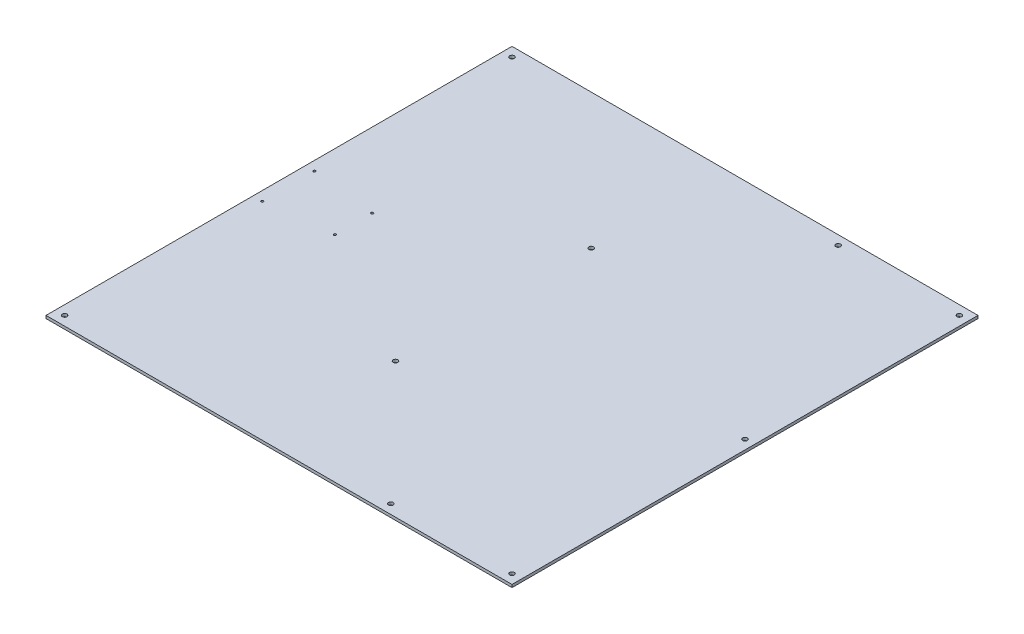
ISO-10303-21;
HEADER;
FILE_DESCRIPTION(('STEP AP214'),'2;1');
FILE_NAME('part.step','',(''),(''),'','','');
FILE_SCHEMA(('AUTOMOTIVE_DESIGN { 1 0 10303 214 1 1 1 1 }'));
ENDSEC;
DATA;
#1=APPLICATION_CONTEXT('core data for automotive mechanical design processes');
#2=APPLICATION_PROTOCOL_DEFINITION('international standard','automotive_design',2000,#1);
#3=PRODUCT_CONTEXT('',#1,'mechanical');
#4=PRODUCT('Part','Part','',(#3));
#5=PRODUCT_RELATED_PRODUCT_CATEGORY('part','',(#4));
#6=PRODUCT_DEFINITION_FORMATION('','',#4);
#7=PRODUCT_DEFINITION_CONTEXT('part definition',#1,'design');
#8=PRODUCT_DEFINITION('design','',#6,#7);
#9=PRODUCT_DEFINITION_SHAPE('','',#8);
#10=(LENGTH_UNIT() NAMED_UNIT(*) SI_UNIT(.MILLI.,.METRE.));
#11=(NAMED_UNIT(*) PLANE_ANGLE_UNIT() SI_UNIT($,.RADIAN.));
#12=(NAMED_UNIT(*) SI_UNIT($,.STERADIAN.) SOLID_ANGLE_UNIT());
#13=UNCERTAINTY_MEASURE_WITH_UNIT(LENGTH_MEASURE(1.E-05),#10,'distance_accuracy_value','');
#14=(GEOMETRIC_REPRESENTATION_CONTEXT(3) GLOBAL_UNCERTAINTY_ASSIGNED_CONTEXT((#13)) GLOBAL_UNIT_ASSIGNED_CONTEXT((#10,
#11,#12)) REPRESENTATION_CONTEXT('',''));
#15=CARTESIAN_POINT('',(0.,0.,0.));
#16=DIRECTION('',(0.,0.,1.));
#17=DIRECTION('',(1.,0.,0.));
#18=AXIS2_PLACEMENT_3D('',#15,#16,#17);
#19=CARTESIAN_POINT('',(250.,3.,-250.));
#20=DIRECTION('',(-1.,0.,0.));
#21=DIRECTION('',(0.,0.,1.));
#22=AXIS2_PLACEMENT_3D('',#19,#20,#21);
#23=PLANE('',#22);
#24=DIRECTION('',(0.,0.,-1.));
#25=VECTOR('',#24,1.);
#26=CARTESIAN_POINT('',(250.,0.,-250.));
#27=LINE('',#26,#25);
#28=CARTESIAN_POINT('',(250.,0.,250.));
#29=VERTEX_POINT('',#28);
#30=CARTESIAN_POINT('',(250.,0.,-250.));
#31=VERTEX_POINT('',#30);
#32=EDGE_CURVE('E96',#29,#31,#27,.T.);
#33=ORIENTED_EDGE('',*,*,#32,.T.);
#34=DIRECTION('',(0.,-1.,0.));
#35=VECTOR('',#34,1.);
#36=CARTESIAN_POINT('',(250.,3.,-250.));
#37=LINE('',#36,#35);
#38=CARTESIAN_POINT('',(250.,3.,-250.));
#39=VERTEX_POINT('',#38);
#40=EDGE_CURVE('E11',#39,#31,#37,.T.);
#41=ORIENTED_EDGE('',*,*,#40,.F.);
#42=DIRECTION('',(0.,0.,-1.));
#43=VECTOR('',#42,1.);
#44=CARTESIAN_POINT('',(250.,3.,-250.));
#45=LINE('',#44,#43);
#46=CARTESIAN_POINT('',(250.,3.,250.));
#47=VERTEX_POINT('',#46);
#48=EDGE_CURVE('E84',#47,#39,#45,.T.);
#49=ORIENTED_EDGE('',*,*,#48,.F.);
#50=DIRECTION('',(0.,-1.,0.));
#51=VECTOR('',#50,1.);
#52=CARTESIAN_POINT('',(250.,3.,250.));
#53=LINE('',#52,#51);
#54=EDGE_CURVE('E92',#47,#29,#53,.T.);
#55=ORIENTED_EDGE('',*,*,#54,.T.);
#56=EDGE_LOOP('',(#33,#41,#49,#55));
#57=FACE_BOUND('',#56,.T.);
#58=ADVANCED_FACE('F33',(#57),#23,.F.);
#59=CARTESIAN_POINT('',(-250.,3.,-250.));
#60=DIRECTION('',(0.,0.,1.));
#61=DIRECTION('',(1.,0.,0.));
#62=AXIS2_PLACEMENT_3D('',#59,#60,#61);
#63=PLANE('',#62);
#64=DIRECTION('',(-1.,0.,0.));
#65=VECTOR('',#64,1.);
#66=CARTESIAN_POINT('',(-250.,0.,-250.));
#67=LINE('',#66,#65);
#68=CARTESIAN_POINT('',(-250.,0.,-250.));
#69=VERTEX_POINT('',#68);
#70=EDGE_CURVE('E88',#31,#69,#67,.T.);
#71=ORIENTED_EDGE('',*,*,#70,.T.);
#72=DIRECTION('',(0.,-1.,0.));
#73=VECTOR('',#72,1.);
#74=CARTESIAN_POINT('',(-250.,3.,-250.));
#75=LINE('',#74,#73);
#76=CARTESIAN_POINT('',(-250.,3.,-250.));
#77=VERTEX_POINT('',#76);
#78=EDGE_CURVE('E41',#77,#69,#75,.T.);
#79=ORIENTED_EDGE('',*,*,#78,.F.);
#80=DIRECTION('',(-1.,0.,0.));
#81=VECTOR('',#80,1.);
#82=CARTESIAN_POINT('',(-250.,3.,-250.));
#83=LINE('',#82,#81);
#84=EDGE_CURVE('E79',#39,#77,#83,.T.);
#85=ORIENTED_EDGE('',*,*,#84,.F.);
#86=ORIENTED_EDGE('',*,*,#40,.T.);
#87=EDGE_LOOP('',(#71,#79,#85,#86));
#88=FACE_BOUND('',#87,.T.);
#89=ADVANCED_FACE('F87',(#88),#63,.F.);
#90=CARTESIAN_POINT('',(-250.,3.,-250.));
#91=DIRECTION('',(1.,0.,0.));
#92=DIRECTION('',(0.,0.,-1.));
#93=AXIS2_PLACEMENT_3D('',#90,#91,#92);
#94=PLANE('',#93);
#95=DIRECTION('',(0.,0.,1.));
#96=VECTOR('',#95,1.);
#97=CARTESIAN_POINT('',(-250.,0.,-250.));
#98=LINE('',#97,#96);
#99=CARTESIAN_POINT('',(-250.,0.,250.));
#100=VERTEX_POINT('',#99);
#101=EDGE_CURVE('E66',#69,#100,#98,.T.);
#102=ORIENTED_EDGE('',*,*,#101,.T.);
#103=DIRECTION('',(0.,-1.,0.));
#104=VECTOR('',#103,1.);
#105=CARTESIAN_POINT('',(-250.,3.,250.));
#106=LINE('',#105,#104);
#107=CARTESIAN_POINT('',(-250.,3.,250.));
#108=VERTEX_POINT('',#107);
#109=EDGE_CURVE('E89',#108,#100,#106,.T.);
#110=ORIENTED_EDGE('',*,*,#109,.F.);
#111=DIRECTION('',(0.,0.,1.));
#112=VECTOR('',#111,1.);
#113=CARTESIAN_POINT('',(-250.,3.,-250.));
#114=LINE('',#113,#112);
#115=EDGE_CURVE('E82',#77,#108,#114,.T.);
#116=ORIENTED_EDGE('',*,*,#115,.F.);
#117=ORIENTED_EDGE('',*,*,#78,.T.);
#118=EDGE_LOOP('',(#102,#110,#116,#117));
#119=FACE_BOUND('',#118,.T.);
#120=ADVANCED_FACE('F90',(#119),#94,.F.);
#121=CARTESIAN_POINT('',(-250.,3.,250.));
#122=DIRECTION('',(0.,0.,-1.));
#123=DIRECTION('',(-1.,0.,0.));
#124=AXIS2_PLACEMENT_3D('',#121,#122,#123);
#125=PLANE('',#124);
#126=DIRECTION('',(1.,0.,0.));
#127=VECTOR('',#126,1.);
#128=CARTESIAN_POINT('',(-250.,0.,250.));
#129=LINE('',#128,#127);
#130=EDGE_CURVE('E72',#100,#29,#129,.T.);
#131=ORIENTED_EDGE('',*,*,#130,.T.);
#132=ORIENTED_EDGE('',*,*,#54,.F.);
#133=DIRECTION('',(1.,0.,0.));
#134=VECTOR('',#133,1.);
#135=CARTESIAN_POINT('',(-250.,3.,250.));
#136=LINE('',#135,#134);
#137=EDGE_CURVE('E49',#108,#47,#136,.T.);
#138=ORIENTED_EDGE('',*,*,#137,.F.);
#139=ORIENTED_EDGE('',*,*,#109,.T.);
#140=EDGE_LOOP('',(#131,#132,#138,#139));
#141=FACE_BOUND('',#140,.T.);
#142=ADVANCED_FACE('F104',(#141),#125,.F.);
#143=CARTESIAN_POINT('',(0.,3.,0.));
#144=DIRECTION('',(0.,1.,0.));
#145=DIRECTION('',(0.,0.,1.));
#146=AXIS2_PLACEMENT_3D('',#143,#144,#145);
#147=PLANE('',#146);
#148=CARTESIAN_POINT('',(-20.0000000000001,3.,-105.));
#149=DIRECTION('',(0.,1.,0.));
#150=DIRECTION('',(0.,0.,1.));
#151=AXIS2_PLACEMENT_3D('',#148,#149,#150);
#152=CIRCLE('',#151,2.50000000000001);
#153=CARTESIAN_POINT('',(-20.0000000000001,3.,-102.5));
#154=VERTEX_POINT('',#153);
#155=EDGE_CURVE('E179',#154,#154,#152,.T.);
#156=ORIENTED_EDGE('',*,*,#155,.F.);
#157=EDGE_LOOP('',(#156));
#158=FACE_BOUND('',#157,.T.);
#159=CARTESIAN_POINT('',(-20.0000000000001,3.,105.));
#160=DIRECTION('',(0.,1.,0.));
#161=DIRECTION('',(0.,0.,1.));
#162=AXIS2_PLACEMENT_3D('',#159,#160,#161);
#163=CIRCLE('',#162,2.50000000000001);
#164=CARTESIAN_POINT('',(-20.0000000000001,3.,107.5));
#165=VERTEX_POINT('',#164);
#166=EDGE_CURVE('E180',#165,#165,#163,.T.);
#167=ORIENTED_EDGE('',*,*,#166,.F.);
#168=EDGE_LOOP('',(#167));
#169=FACE_BOUND('',#168,.T.);
#170=CARTESIAN_POINT('',(240.,3.,-10.0000000000001));
#171=DIRECTION('',(0.,1.,0.));
#172=DIRECTION('',(0.,0.,1.));
#173=AXIS2_PLACEMENT_3D('',#170,#171,#172);
#174=CIRCLE('',#173,2.5);
#175=CARTESIAN_POINT('',(240.,3.,-7.50000000000015));
#176=VERTEX_POINT('',#175);
#177=EDGE_CURVE('E169',#176,#176,#174,.T.);
#178=ORIENTED_EDGE('',*,*,#177,.F.);
#179=EDGE_LOOP('',(#178));
#180=FACE_BOUND('',#179,.T.);
#181=CARTESIAN_POINT('',(110.,3.,-240.));
#182=DIRECTION('',(0.,1.,0.));
#183=DIRECTION('',(0.,0.,1.));
#184=AXIS2_PLACEMENT_3D('',#181,#182,#183);
#185=CIRCLE('',#184,2.49999999999998);
#186=CARTESIAN_POINT('',(110.,3.,-237.5));
#187=VERTEX_POINT('',#186);
#188=EDGE_CURVE('E161',#187,#187,#185,.T.);
#189=ORIENTED_EDGE('',*,*,#188,.F.);
#190=EDGE_LOOP('',(#189));
#191=FACE_BOUND('',#190,.T.);
#192=CARTESIAN_POINT('',(110.,3.,240.));
#193=DIRECTION('',(0.,1.,0.));
#194=DIRECTION('',(0.,0.,1.));
#195=AXIS2_PLACEMENT_3D('',#192,#193,#194);
#196=CIRCLE('',#195,2.5);
#197=CARTESIAN_POINT('',(110.,3.,242.5));
#198=VERTEX_POINT('',#197);
#199=EDGE_CURVE('E162',#198,#198,#196,.T.);
#200=ORIENTED_EDGE('',*,*,#199,.F.);
#201=EDGE_LOOP('',(#200));
#202=FACE_BOUND('',#201,.T.);
#203=CARTESIAN_POINT('',(-240.,3.,-28.0000000000001));
#204=DIRECTION('',(0.,1.,0.));
#205=DIRECTION('',(0.,0.,1.));
#206=AXIS2_PLACEMENT_3D('',#203,#204,#205);
#207=CIRCLE('',#206,1.25000000000001);
#208=CARTESIAN_POINT('',(-240.,3.,-26.75));
#209=VERTEX_POINT('',#208);
#210=EDGE_CURVE('E151',#209,#209,#207,.T.);
#211=ORIENTED_EDGE('',*,*,#210,.F.);
#212=EDGE_LOOP('',(#211));
#213=FACE_BOUND('',#212,.T.);
#214=CARTESIAN_POINT('',(-170.,3.,-20.0000000000001));
#215=DIRECTION('',(0.,1.,0.));
#216=DIRECTION('',(0.,0.,1.));
#217=AXIS2_PLACEMENT_3D('',#214,#215,#216);
#218=CIRCLE('',#217,1.25000000000001);
#219=CARTESIAN_POINT('',(-170.,3.,-18.75));
#220=VERTEX_POINT('',#219);
#221=EDGE_CURVE('E145',#220,#220,#218,.T.);
#222=ORIENTED_EDGE('',*,*,#221,.F.);
#223=EDGE_LOOP('',(#222));
#224=FACE_BOUND('',#223,.T.);
#225=CARTESIAN_POINT('',(-170.,3.,20.0000000000001));
#226=DIRECTION('',(0.,1.,0.));
#227=DIRECTION('',(0.,0.,-1.));
#228=AXIS2_PLACEMENT_3D('',#225,#226,#227);
#229=CIRCLE('',#228,1.25000000000001);
#230=CARTESIAN_POINT('',(-170.,3.,18.7500000000001));
#231=VERTEX_POINT('',#230);
#232=EDGE_CURVE('E137',#231,#231,#229,.T.);
#233=ORIENTED_EDGE('',*,*,#232,.F.);
#234=EDGE_LOOP('',(#233));
#235=FACE_BOUND('',#234,.T.);
#236=CARTESIAN_POINT('',(-240.,3.,28.));
#237=DIRECTION('',(0.,1.,0.));
#238=DIRECTION('',(0.,0.,-1.));
#239=AXIS2_PLACEMENT_3D('',#236,#237,#238);
#240=CIRCLE('',#239,1.25000000000001);
#241=CARTESIAN_POINT('',(-240.,3.,26.7499999999999));
#242=VERTEX_POINT('',#241);
#243=EDGE_CURVE('E138',#242,#242,#240,.T.);
#244=ORIENTED_EDGE('',*,*,#243,.F.);
#245=EDGE_LOOP('',(#244));
#246=FACE_BOUND('',#245,.T.);
#247=CARTESIAN_POINT('',(-240.,3.,240.));
#248=DIRECTION('',(0.,1.,0.));
#249=DIRECTION('',(0.,0.,-1.));
#250=AXIS2_PLACEMENT_3D('',#247,#248,#249);
#251=CIRCLE('',#250,2.5);
#252=CARTESIAN_POINT('',(-240.,3.,237.5));
#253=VERTEX_POINT('',#252);
#254=EDGE_CURVE('E120',#253,#253,#251,.T.);
#255=ORIENTED_EDGE('',*,*,#254,.F.);
#256=EDGE_LOOP('',(#255));
#257=FACE_BOUND('',#256,.T.);
#258=CARTESIAN_POINT('',(240.,3.,240.));
#259=DIRECTION('',(0.,1.,0.));
#260=DIRECTION('',(0.,0.,1.));
#261=AXIS2_PLACEMENT_3D('',#258,#259,#260);
#262=CIRCLE('',#261,2.5);
#263=CARTESIAN_POINT('',(240.,3.,242.5));
#264=VERTEX_POINT('',#263);
#265=EDGE_CURVE('E119',#264,#264,#262,.T.);
#266=ORIENTED_EDGE('',*,*,#265,.F.);
#267=EDGE_LOOP('',(#266));
#268=FACE_BOUND('',#267,.T.);
#269=CARTESIAN_POINT('',(240.,3.,-240.));
#270=DIRECTION('',(0.,1.,0.));
#271=DIRECTION('',(0.,0.,-1.));
#272=AXIS2_PLACEMENT_3D('',#269,#270,#271);
#273=CIRCLE('',#272,2.5);
#274=CARTESIAN_POINT('',(240.,3.,-242.5));
#275=VERTEX_POINT('',#274);
#276=EDGE_CURVE('E127',#275,#275,#273,.T.);
#277=ORIENTED_EDGE('',*,*,#276,.F.);
#278=EDGE_LOOP('',(#277));
#279=FACE_BOUND('',#278,.T.);
#280=CARTESIAN_POINT('',(-240.,3.,-240.));
#281=DIRECTION('',(0.,1.,0.));
#282=DIRECTION('',(0.,0.,1.));
#283=AXIS2_PLACEMENT_3D('',#280,#281,#282);
#284=CIRCLE('',#283,2.5);
#285=CARTESIAN_POINT('',(-240.,3.,-237.5));
#286=VERTEX_POINT('',#285);
#287=EDGE_CURVE('E112',#286,#286,#284,.T.);
#288=ORIENTED_EDGE('',*,*,#287,.F.);
#289=EDGE_LOOP('',(#288));
#290=FACE_BOUND('',#289,.T.);
#291=ORIENTED_EDGE('',*,*,#48,.T.);
#292=ORIENTED_EDGE('',*,*,#84,.T.);
#293=ORIENTED_EDGE('',*,*,#115,.T.);
#294=ORIENTED_EDGE('',*,*,#137,.T.);
#295=EDGE_LOOP('',(#291,#292,#293,#294));
#296=FACE_BOUND('',#295,.T.);
#297=ADVANCED_FACE('F80',(#158,#169,#180,#191,#202,#213,#224,#235,#246,#257,#268,#279,#290,
#296),#147,.T.);
#298=CARTESIAN_POINT('',(0.,0.,0.));
#299=DIRECTION('',(0.,1.,0.));
#300=DIRECTION('',(0.,0.,1.));
#301=AXIS2_PLACEMENT_3D('',#298,#299,#300);
#302=PLANE('',#301);
#303=CARTESIAN_POINT('',(-20.0000000000001,0.,-105.));
#304=DIRECTION('',(0.,1.,0.));
#305=DIRECTION('',(0.,0.,1.));
#306=AXIS2_PLACEMENT_3D('',#303,#304,#305);
#307=CIRCLE('',#306,2.50000000000001);
#308=CARTESIAN_POINT('',(-20.0000000000001,0.,-102.5));
#309=VERTEX_POINT('',#308);
#310=EDGE_CURVE('E165',#309,#309,#307,.F.);
#311=ORIENTED_EDGE('',*,*,#310,.F.);
#312=EDGE_LOOP('',(#311));
#313=FACE_BOUND('',#312,.T.);
#314=CARTESIAN_POINT('',(-20.0000000000001,0.,105.));
#315=DIRECTION('',(0.,1.,0.));
#316=DIRECTION('',(0.,0.,1.));
#317=AXIS2_PLACEMENT_3D('',#314,#315,#316);
#318=CIRCLE('',#317,2.50000000000001);
#319=CARTESIAN_POINT('',(-20.0000000000001,0.,107.5));
#320=VERTEX_POINT('',#319);
#321=EDGE_CURVE('E176',#320,#320,#318,.F.);
#322=ORIENTED_EDGE('',*,*,#321,.F.);
#323=EDGE_LOOP('',(#322));
#324=FACE_BOUND('',#323,.T.);
#325=CARTESIAN_POINT('',(240.,0.,-10.0000000000001));
#326=DIRECTION('',(0.,1.,0.));
#327=DIRECTION('',(0.,0.,1.));
#328=AXIS2_PLACEMENT_3D('',#325,#326,#327);
#329=CIRCLE('',#328,2.5);
#330=CARTESIAN_POINT('',(240.,0.,-7.50000000000015));
#331=VERTEX_POINT('',#330);
#332=EDGE_CURVE('E141',#331,#331,#329,.F.);
#333=ORIENTED_EDGE('',*,*,#332,.F.);
#334=EDGE_LOOP('',(#333));
#335=FACE_BOUND('',#334,.T.);
#336=CARTESIAN_POINT('',(110.,0.,-240.));
#337=DIRECTION('',(0.,1.,0.));
#338=DIRECTION('',(0.,0.,1.));
#339=AXIS2_PLACEMENT_3D('',#336,#337,#338);
#340=CIRCLE('',#339,2.49999999999998);
#341=CARTESIAN_POINT('',(110.,0.,-237.5));
#342=VERTEX_POINT('',#341);
#343=EDGE_CURVE('E166',#342,#342,#340,.F.);
#344=ORIENTED_EDGE('',*,*,#343,.F.);
#345=EDGE_LOOP('',(#344));
#346=FACE_BOUND('',#345,.T.);
#347=CARTESIAN_POINT('',(110.,0.,240.));
#348=DIRECTION('',(0.,1.,0.));
#349=DIRECTION('',(0.,0.,1.));
#350=AXIS2_PLACEMENT_3D('',#347,#348,#349);
#351=CIRCLE('',#350,2.5);
#352=CARTESIAN_POINT('',(110.,0.,242.5));
#353=VERTEX_POINT('',#352);
#354=EDGE_CURVE('E158',#353,#353,#351,.F.);
#355=ORIENTED_EDGE('',*,*,#354,.F.);
#356=EDGE_LOOP('',(#355));
#357=FACE_BOUND('',#356,.T.);
#358=CARTESIAN_POINT('',(-240.,0.,-28.0000000000001));
#359=DIRECTION('',(0.,1.,0.));
#360=DIRECTION('',(0.,0.,1.));
#361=AXIS2_PLACEMENT_3D('',#358,#359,#360);
#362=CIRCLE('',#361,1.25000000000001);
#363=CARTESIAN_POINT('',(-240.,0.,-26.75));
#364=VERTEX_POINT('',#363);
#365=EDGE_CURVE('E123',#364,#364,#362,.F.);
#366=ORIENTED_EDGE('',*,*,#365,.F.);
#367=EDGE_LOOP('',(#366));
#368=FACE_BOUND('',#367,.T.);
#369=CARTESIAN_POINT('',(-170.,0.,-20.0000000000001));
#370=DIRECTION('',(0.,1.,0.));
#371=DIRECTION('',(0.,0.,1.));
#372=AXIS2_PLACEMENT_3D('',#369,#370,#371);
#373=CIRCLE('',#372,1.25000000000001);
#374=CARTESIAN_POINT('',(-170.,0.,-18.75));
#375=VERTEX_POINT('',#374);
#376=EDGE_CURVE('E148',#375,#375,#373,.F.);
#377=ORIENTED_EDGE('',*,*,#376,.F.);
#378=EDGE_LOOP('',(#377));
#379=FACE_BOUND('',#378,.T.);
#380=CARTESIAN_POINT('',(-170.,0.,20.0000000000001));
#381=DIRECTION('',(0.,1.,0.));
#382=DIRECTION('',(0.,0.,1.));
#383=AXIS2_PLACEMENT_3D('',#380,#381,#382);
#384=CIRCLE('',#383,1.25000000000001);
#385=CARTESIAN_POINT('',(-170.,0.,21.2500000000001));
#386=VERTEX_POINT('',#385);
#387=EDGE_CURVE('E142',#386,#386,#384,.F.);
#388=ORIENTED_EDGE('',*,*,#387,.F.);
#389=EDGE_LOOP('',(#388));
#390=FACE_BOUND('',#389,.T.);
#391=CARTESIAN_POINT('',(-240.,0.,28.));
#392=DIRECTION('',(0.,1.,0.));
#393=DIRECTION('',(0.,0.,1.));
#394=AXIS2_PLACEMENT_3D('',#391,#392,#393);
#395=CIRCLE('',#394,1.25000000000001);
#396=CARTESIAN_POINT('',(-240.,0.,29.25));
#397=VERTEX_POINT('',#396);
#398=EDGE_CURVE('E134',#397,#397,#395,.F.);
#399=ORIENTED_EDGE('',*,*,#398,.F.);
#400=EDGE_LOOP('',(#399));
#401=FACE_BOUND('',#400,.T.);
#402=CARTESIAN_POINT('',(-240.,0.,240.));
#403=DIRECTION('',(0.,1.,0.));
#404=DIRECTION('',(0.,0.,1.));
#405=AXIS2_PLACEMENT_3D('',#402,#403,#404);
#406=CIRCLE('',#405,2.5);
#407=CARTESIAN_POINT('',(-240.,0.,242.5));
#408=VERTEX_POINT('',#407);
#409=EDGE_CURVE('E116',#408,#408,#406,.F.);
#410=ORIENTED_EDGE('',*,*,#409,.F.);
#411=EDGE_LOOP('',(#410));
#412=FACE_BOUND('',#411,.T.);
#413=CARTESIAN_POINT('',(240.,0.,240.));
#414=DIRECTION('',(0.,1.,0.));
#415=DIRECTION('',(0.,0.,1.));
#416=AXIS2_PLACEMENT_3D('',#413,#414,#415);
#417=CIRCLE('',#416,2.5);
#418=CARTESIAN_POINT('',(240.,0.,242.5));
#419=VERTEX_POINT('',#418);
#420=EDGE_CURVE('E124',#419,#419,#417,.F.);
#421=ORIENTED_EDGE('',*,*,#420,.F.);
#422=EDGE_LOOP('',(#421));
#423=FACE_BOUND('',#422,.T.);
#424=CARTESIAN_POINT('',(240.,0.,-240.));
#425=DIRECTION('',(0.,1.,0.));
#426=DIRECTION('',(0.,0.,1.));
#427=AXIS2_PLACEMENT_3D('',#424,#425,#426);
#428=CIRCLE('',#427,2.5);
#429=CARTESIAN_POINT('',(240.,0.,-237.5));
#430=VERTEX_POINT('',#429);
#431=EDGE_CURVE('E115',#430,#430,#428,.F.);
#432=ORIENTED_EDGE('',*,*,#431,.F.);
#433=EDGE_LOOP('',(#432));
#434=FACE_BOUND('',#433,.T.);
#435=CARTESIAN_POINT('',(-240.,0.,-240.));
#436=DIRECTION('',(0.,1.,0.));
#437=DIRECTION('',(0.,0.,1.));
#438=AXIS2_PLACEMENT_3D('',#435,#436,#437);
#439=CIRCLE('',#438,2.5);
#440=CARTESIAN_POINT('',(-240.,0.,-237.5));
#441=VERTEX_POINT('',#440);
#442=EDGE_CURVE('E99',#441,#441,#439,.F.);
#443=ORIENTED_EDGE('',*,*,#442,.F.);
#444=EDGE_LOOP('',(#443));
#445=FACE_BOUND('',#444,.T.);
#446=ORIENTED_EDGE('',*,*,#32,.F.);
#447=ORIENTED_EDGE('',*,*,#130,.F.);
#448=ORIENTED_EDGE('',*,*,#101,.F.);
#449=ORIENTED_EDGE('',*,*,#70,.F.);
#450=EDGE_LOOP('',(#446,#447,#448,#449));
#451=FACE_BOUND('',#450,.T.);
#452=ADVANCED_FACE('F107',(#313,#324,#335,#346,#357,#368,#379,#390,#401,#412,#423,#434,#445,
#451),#302,.F.);
#453=CARTESIAN_POINT('',(-240.,-7.07106781186548,-240.));
#454=DIRECTION('',(0.,1.,0.));
#455=DIRECTION('',(0.,0.,1.));
#456=AXIS2_PLACEMENT_3D('',#453,#454,#455);
#457=CYLINDRICAL_SURFACE('',#456,2.5);
#458=ORIENTED_EDGE('',*,*,#442,.T.);
#459=EDGE_LOOP('',(#458));
#460=FACE_BOUND('',#459,.T.);
#461=ORIENTED_EDGE('',*,*,#287,.T.);
#462=EDGE_LOOP('',(#461));
#463=FACE_BOUND('',#462,.T.);
#464=ADVANCED_FACE('F217',(#460,#463),#457,.F.);
#465=CARTESIAN_POINT('',(240.,-7.07106781186548,-240.));
#466=DIRECTION('',(0.,1.,0.));
#467=DIRECTION('',(0.,0.,1.));
#468=AXIS2_PLACEMENT_3D('',#465,#466,#467);
#469=CYLINDRICAL_SURFACE('',#468,2.5);
#470=ORIENTED_EDGE('',*,*,#431,.T.);
#471=EDGE_LOOP('',(#470));
#472=FACE_BOUND('',#471,.T.);
#473=ORIENTED_EDGE('',*,*,#276,.T.);
#474=EDGE_LOOP('',(#473));
#475=FACE_BOUND('',#474,.T.);
#476=ADVANCED_FACE('F219',(#472,#475),#469,.F.);
#477=CARTESIAN_POINT('',(240.,-7.07106781186548,240.));
#478=DIRECTION('',(0.,1.,0.));
#479=DIRECTION('',(0.,0.,1.));
#480=AXIS2_PLACEMENT_3D('',#477,#478,#479);
#481=CYLINDRICAL_SURFACE('',#480,2.5);
#482=ORIENTED_EDGE('',*,*,#420,.T.);
#483=EDGE_LOOP('',(#482));
#484=FACE_BOUND('',#483,.T.);
#485=ORIENTED_EDGE('',*,*,#265,.T.);
#486=EDGE_LOOP('',(#485));
#487=FACE_BOUND('',#486,.T.);
#488=ADVANCED_FACE('F226',(#484,#487),#481,.F.);
#489=CARTESIAN_POINT('',(-240.,-7.07106781186548,240.));
#490=DIRECTION('',(0.,1.,0.));
#491=DIRECTION('',(0.,0.,1.));
#492=AXIS2_PLACEMENT_3D('',#489,#490,#491);
#493=CYLINDRICAL_SURFACE('',#492,2.5);
#494=ORIENTED_EDGE('',*,*,#409,.T.);
#495=EDGE_LOOP('',(#494));
#496=FACE_BOUND('',#495,.T.);
#497=ORIENTED_EDGE('',*,*,#254,.T.);
#498=EDGE_LOOP('',(#497));
#499=FACE_BOUND('',#498,.T.);
#500=ADVANCED_FACE('F309',(#496,#499),#493,.F.);
#501=CARTESIAN_POINT('',(-240.,-3.53553390593276,28.));
#502=DIRECTION('',(0.,1.,0.));
#503=DIRECTION('',(0.,0.,1.));
#504=AXIS2_PLACEMENT_3D('',#501,#502,#503);
#505=CYLINDRICAL_SURFACE('',#504,1.25000000000001);
#506=ORIENTED_EDGE('',*,*,#398,.T.);
#507=EDGE_LOOP('',(#506));
#508=FACE_BOUND('',#507,.T.);
#509=ORIENTED_EDGE('',*,*,#243,.T.);
#510=EDGE_LOOP('',(#509));
#511=FACE_BOUND('',#510,.T.);
#512=ADVANCED_FACE('F306',(#508,#511),#505,.F.);
#513=CARTESIAN_POINT('',(-170.,-3.53553390593276,20.0000000000001));
#514=DIRECTION('',(0.,1.,0.));
#515=DIRECTION('',(0.,0.,1.));
#516=AXIS2_PLACEMENT_3D('',#513,#514,#515);
#517=CYLINDRICAL_SURFACE('',#516,1.25000000000001);
#518=ORIENTED_EDGE('',*,*,#387,.T.);
#519=EDGE_LOOP('',(#518));
#520=FACE_BOUND('',#519,.T.);
#521=ORIENTED_EDGE('',*,*,#232,.T.);
#522=EDGE_LOOP('',(#521));
#523=FACE_BOUND('',#522,.T.);
#524=ADVANCED_FACE('F302',(#520,#523),#517,.F.);
#525=CARTESIAN_POINT('',(-170.,-3.53553390593276,-20.0000000000001));
#526=DIRECTION('',(0.,1.,0.));
#527=DIRECTION('',(0.,0.,1.));
#528=AXIS2_PLACEMENT_3D('',#525,#526,#527);
#529=CYLINDRICAL_SURFACE('',#528,1.25000000000001);
#530=ORIENTED_EDGE('',*,*,#376,.T.);
#531=EDGE_LOOP('',(#530));
#532=FACE_BOUND('',#531,.T.);
#533=ORIENTED_EDGE('',*,*,#221,.T.);
#534=EDGE_LOOP('',(#533));
#535=FACE_BOUND('',#534,.T.);
#536=ADVANCED_FACE('F298',(#532,#535),#529,.F.);
#537=CARTESIAN_POINT('',(-240.,-3.53553390593276,-28.0000000000001));
#538=DIRECTION('',(0.,1.,0.));
#539=DIRECTION('',(0.,0.,1.));
#540=AXIS2_PLACEMENT_3D('',#537,#538,#539);
#541=CYLINDRICAL_SURFACE('',#540,1.25000000000001);
#542=ORIENTED_EDGE('',*,*,#365,.T.);
#543=EDGE_LOOP('',(#542));
#544=FACE_BOUND('',#543,.T.);
#545=ORIENTED_EDGE('',*,*,#210,.T.);
#546=EDGE_LOOP('',(#545));
#547=FACE_BOUND('',#546,.T.);
#548=ADVANCED_FACE('F294',(#544,#547),#541,.F.);
#549=CARTESIAN_POINT('',(110.,-7.07106781186548,240.));
#550=DIRECTION('',(0.,1.,0.));
#551=DIRECTION('',(0.,0.,1.));
#552=AXIS2_PLACEMENT_3D('',#549,#550,#551);
#553=CYLINDRICAL_SURFACE('',#552,2.5);
#554=ORIENTED_EDGE('',*,*,#354,.T.);
#555=EDGE_LOOP('',(#554));
#556=FACE_BOUND('',#555,.T.);
#557=ORIENTED_EDGE('',*,*,#199,.T.);
#558=EDGE_LOOP('',(#557));
#559=FACE_BOUND('',#558,.T.);
#560=ADVANCED_FACE('F290',(#556,#559),#553,.F.);
#561=CARTESIAN_POINT('',(110.,-7.07106781186548,-240.));
#562=DIRECTION('',(0.,1.,0.));
#563=DIRECTION('',(0.,0.,1.));
#564=AXIS2_PLACEMENT_3D('',#561,#562,#563);
#565=CYLINDRICAL_SURFACE('',#564,2.49999999999998);
#566=ORIENTED_EDGE('',*,*,#343,.T.);
#567=EDGE_LOOP('',(#566));
#568=FACE_BOUND('',#567,.T.);
#569=ORIENTED_EDGE('',*,*,#188,.T.);
#570=EDGE_LOOP('',(#569));
#571=FACE_BOUND('',#570,.T.);
#572=ADVANCED_FACE('F286',(#568,#571),#565,.F.);
#573=CARTESIAN_POINT('',(240.,-7.07106781186548,-10.0000000000001));
#574=DIRECTION('',(0.,1.,0.));
#575=DIRECTION('',(0.,0.,1.));
#576=AXIS2_PLACEMENT_3D('',#573,#574,#575);
#577=CYLINDRICAL_SURFACE('',#576,2.5);
#578=ORIENTED_EDGE('',*,*,#332,.T.);
#579=EDGE_LOOP('',(#578));
#580=FACE_BOUND('',#579,.T.);
#581=ORIENTED_EDGE('',*,*,#177,.T.);
#582=EDGE_LOOP('',(#581));
#583=FACE_BOUND('',#582,.T.);
#584=ADVANCED_FACE('F268',(#580,#583),#577,.F.);
#585=CARTESIAN_POINT('',(-20.0000000000001,-7.07106781186549,105.));
#586=DIRECTION('',(0.,1.,0.));
#587=DIRECTION('',(0.,0.,1.));
#588=AXIS2_PLACEMENT_3D('',#585,#586,#587);
#589=CYLINDRICAL_SURFACE('',#588,2.50000000000001);
#590=ORIENTED_EDGE('',*,*,#321,.T.);
#591=EDGE_LOOP('',(#590));
#592=FACE_BOUND('',#591,.T.);
#593=ORIENTED_EDGE('',*,*,#166,.T.);
#594=EDGE_LOOP('',(#593));
#595=FACE_BOUND('',#594,.T.);
#596=ADVANCED_FACE('F263',(#592,#595),#589,.F.);
#597=CARTESIAN_POINT('',(-20.0000000000001,-7.07106781186549,-105.));
#598=DIRECTION('',(0.,1.,0.));
#599=DIRECTION('',(0.,0.,1.));
#600=AXIS2_PLACEMENT_3D('',#597,#598,#599);
#601=CYLINDRICAL_SURFACE('',#600,2.50000000000001);
#602=ORIENTED_EDGE('',*,*,#310,.T.);
#603=EDGE_LOOP('',(#602));
#604=FACE_BOUND('',#603,.T.);
#605=ORIENTED_EDGE('',*,*,#155,.T.);
#606=EDGE_LOOP('',(#605));
#607=FACE_BOUND('',#606,.T.);
#608=ADVANCED_FACE('F188',(#604,#607),#601,.F.);
#609=CLOSED_SHELL('',(#58,#89,#120,#142,#297,#452,#464,#476,#488,#500,#512,#524,#536,#548,#560,
#572,#584,#596,#608));
#610=MANIFOLD_SOLID_BREP('B2',#609);
#611=ADVANCED_BREP_SHAPE_REPRESENTATION('',(#18,#610),#14);
#612=SHAPE_DEFINITION_REPRESENTATION(#9,#611);
ENDSEC;
END-ISO-10303-21;
